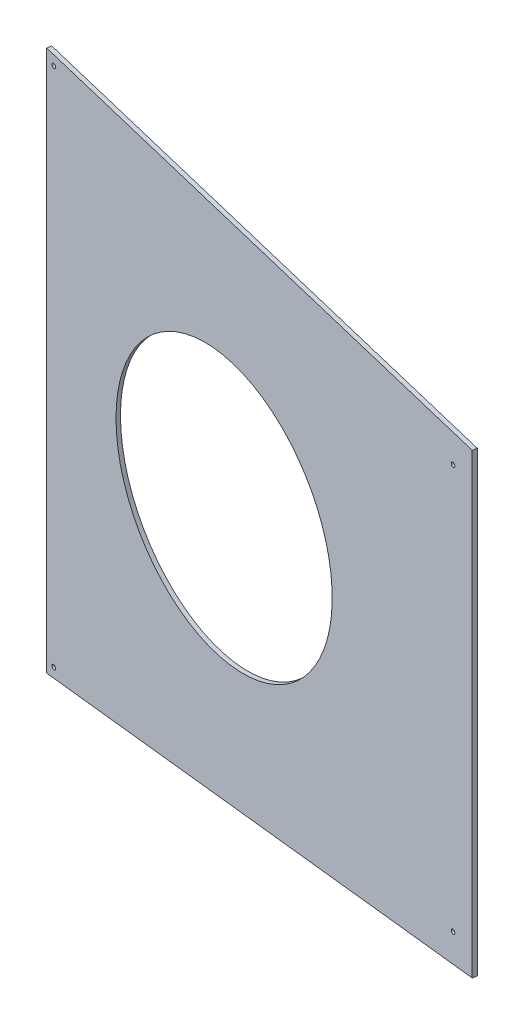
ISO-10303-21;
HEADER;
FILE_DESCRIPTION(('STEP AP214'),'2;1');
FILE_NAME('part.step','',(''),(''),'','','');
FILE_SCHEMA(('AUTOMOTIVE_DESIGN { 1 0 10303 214 1 1 1 1 }'));
ENDSEC;
DATA;
#1=APPLICATION_CONTEXT('core data for automotive mechanical design processes');
#2=APPLICATION_PROTOCOL_DEFINITION('international standard','automotive_design',2000,#1);
#3=PRODUCT_CONTEXT('',#1,'mechanical');
#4=PRODUCT('Part','Part','',(#3));
#5=PRODUCT_RELATED_PRODUCT_CATEGORY('part','',(#4));
#6=PRODUCT_DEFINITION_FORMATION('','',#4);
#7=PRODUCT_DEFINITION_CONTEXT('part definition',#1,'design');
#8=PRODUCT_DEFINITION('design','',#6,#7);
#9=PRODUCT_DEFINITION_SHAPE('','',#8);
#10=(LENGTH_UNIT() NAMED_UNIT(*) SI_UNIT(.MILLI.,.METRE.));
#11=(NAMED_UNIT(*) PLANE_ANGLE_UNIT() SI_UNIT($,.RADIAN.));
#12=(NAMED_UNIT(*) SI_UNIT($,.STERADIAN.) SOLID_ANGLE_UNIT());
#13=UNCERTAINTY_MEASURE_WITH_UNIT(LENGTH_MEASURE(1.E-05),#10,'distance_accuracy_value','');
#14=(GEOMETRIC_REPRESENTATION_CONTEXT(3) GLOBAL_UNCERTAINTY_ASSIGNED_CONTEXT((#13)) GLOBAL_UNIT_ASSIGNED_CONTEXT((#10,
#11,#12)) REPRESENTATION_CONTEXT('',''));
#15=CARTESIAN_POINT('',(0.,0.,0.));
#16=DIRECTION('',(0.,0.,1.));
#17=DIRECTION('',(1.,0.,0.));
#18=AXIS2_PLACEMENT_3D('',#15,#16,#17);
#19=CARTESIAN_POINT('',(-98.8450874332296,-2540.,1498.6));
#20=DIRECTION('',(0.,0.,-1.));
#21=DIRECTION('',(-1.,0.,0.));
#22=AXIS2_PLACEMENT_3D('',#19,#20,#21);
#23=CYLINDRICAL_SURFACE('',#22,190.5);
#24=CARTESIAN_POINT('',(-98.8450874332296,-2540.,1762.20064492164));
#25=DIRECTION('',(-0.177172313667308,0.,0.984179847014647));
#26=DIRECTION('',(-0.984179847014647,0.,-0.177172313667308));
#27=AXIS2_PLACEMENT_3D('',#24,#25,#26);
#28=ELLIPSE('',#27,193.562183352821,190.5);
#29=CARTESIAN_POINT('',(-289.34508743323,-2540.,1727.90678505852));
#30=VERTEX_POINT('',#29);
#31=EDGE_CURVE('E19',#30,#30,#28,.F.);
#32=ORIENTED_EDGE('',*,*,#31,.F.);
#33=EDGE_LOOP('',(#32));
#34=FACE_BOUND('',#33,.T.);
#35=CARTESIAN_POINT('',(-98.8450874332296,-2540.,1755.7485721433));
#36=DIRECTION('',(-0.177172313667308,0.,0.984179847014647));
#37=DIRECTION('',(-0.984179847014647,0.,-0.177172313667308));
#38=AXIS2_PLACEMENT_3D('',#35,#36,#37);
#39=ELLIPSE('',#38,193.562183352821,190.5);
#40=CARTESIAN_POINT('',(-289.34508743323,-2540.,1721.45471228019));
#41=VERTEX_POINT('',#40);
#42=EDGE_CURVE('E91',#41,#41,#39,.F.);
#43=ORIENTED_EDGE('',*,*,#42,.T.);
#44=EDGE_LOOP('',(#43));
#45=FACE_BOUND('',#44,.T.);
#46=ADVANCED_FACE('F16',(#34,#45),#23,.F.);
#47=CARTESIAN_POINT('',(-36.5643631475816,-2540.,1773.41243720943));
#48=DIRECTION('',(-0.177172313667308,0.,0.984179847014647));
#49=DIRECTION('',(0.984179847014647,0.,0.177172313667308));
#50=AXIS2_PLACEMENT_3D('',#47,#48,#49);
#51=PLANE('',#50);
#52=CARTESIAN_POINT('',(304.660631596562,-2832.1254858266,1834.83985007831));
#53=DIRECTION('',(0.177172313667308,0.,-0.984179847014646));
#54=DIRECTION('',(-0.984179847014646,0.,-0.177172313667308));
#55=AXIS2_PLACEMENT_3D('',#52,#53,#54);
#56=CIRCLE('',#55,3.175);
#57=CARTESIAN_POINT('',(301.53586058229,-2832.1254858266,1834.27732798242));
#58=VERTEX_POINT('',#57);
#59=EDGE_CURVE('E95',#58,#58,#56,.T.);
#60=ORIENTED_EDGE('',*,*,#59,.T.);
#61=EDGE_LOOP('',(#60));
#62=FACE_BOUND('',#61,.T.);
#63=CARTESIAN_POINT('',(304.660631596562,-2247.87451417467,1834.83985007831));
#64=DIRECTION('',(0.177172313667308,0.,-0.984179847014646));
#65=DIRECTION('',(-0.984179847014646,0.,-0.177172313667308));
#66=AXIS2_PLACEMENT_3D('',#63,#64,#65);
#67=CIRCLE('',#66,3.175);
#68=CARTESIAN_POINT('',(301.53586058229,-2247.87451417467,1834.27732798242));
#69=VERTEX_POINT('',#68);
#70=EDGE_CURVE('E98',#69,#69,#67,.T.);
#71=ORIENTED_EDGE('',*,*,#70,.T.);
#72=EDGE_LOOP('',(#71));
#73=FACE_BOUND('',#72,.T.);
#74=CARTESIAN_POINT('',(-399.03780081066,-2163.74919665094,1708.15987408417));
#75=DIRECTION('',(0.177172313667308,0.,-0.984179847014646));
#76=DIRECTION('',(-0.984179847014646,0.,-0.177172313667308));
#77=AXIS2_PLACEMENT_3D('',#74,#75,#76);
#78=CIRCLE('',#77,3.175);
#79=CARTESIAN_POINT('',(-402.162571824932,-2163.74919665094,1707.59735198828));
#80=VERTEX_POINT('',#79);
#81=EDGE_CURVE('E101',#80,#80,#78,.T.);
#82=ORIENTED_EDGE('',*,*,#81,.T.);
#83=EDGE_LOOP('',(#82));
#84=FACE_BOUND('',#83,.T.);
#85=CARTESIAN_POINT('',(-399.03780081066,-2916.25080334906,1708.15987408417));
#86=DIRECTION('',(0.177172313667308,0.,-0.984179847014646));
#87=DIRECTION('',(-0.984179847014646,0.,-0.177172313667308));
#88=AXIS2_PLACEMENT_3D('',#85,#86,#87);
#89=CIRCLE('',#88,3.175);
#90=CARTESIAN_POINT('',(-402.162571824932,-2916.25080334906,1707.59735198828));
#91=VERTEX_POINT('',#90);
#92=EDGE_CURVE('E103',#91,#91,#89,.T.);
#93=ORIENTED_EDGE('',*,*,#92,.T.);
#94=EDGE_LOOP('',(#93));
#95=FACE_BOUND('',#94,.T.);
#96=ORIENTED_EDGE('',*,*,#31,.T.);
#97=EDGE_LOOP('',(#96));
#98=FACE_BOUND('',#97,.T.);
#99=DIRECTION('',(0.,1.,0.));
#100=VECTOR('',#99,1.);
#101=CARTESIAN_POINT('',(-411.536884860068,-2733.2977772086,1705.90978570218));
#102=LINE('',#101,#100);
#103=CARTESIAN_POINT('',(-411.536884860066,-2148.83999999996,1705.90978570219));
#104=VERTEX_POINT('',#103);
#105=CARTESIAN_POINT('',(-411.536884860059,-2931.16000000014,1705.90978570219));
#106=VERTEX_POINT('',#105);
#107=EDGE_CURVE('E71',#104,#106,#102,.F.);
#108=ORIENTED_EDGE('',*,*,#107,.T.);
#109=DIRECTION('',(-0.981045508331542,-0.0797452222828882,-0.176608069197188));
#110=VECTOR('',#109,1.);
#111=CARTESIAN_POINT('',(338.408158565153,-2870.20000000057,1840.9150887167));
#112=LINE('',#111,#110);
#113=CARTESIAN_POINT('',(338.408158565118,-2870.20000000014,1840.91508871669));
#114=VERTEX_POINT('',#113);
#115=EDGE_CURVE('E67',#114,#106,#112,.T.);
#116=ORIENTED_EDGE('',*,*,#115,.F.);
#117=DIRECTION('',(0.,1.,0.));
#118=VECTOR('',#117,1.);
#119=CARTESIAN_POINT('',(338.408158565108,-2571.5966473095,1840.91508871669));
#120=LINE('',#119,#118);
#121=CARTESIAN_POINT('',(338.408158565109,-2209.79999999998,1840.91508871669));
#122=VERTEX_POINT('',#121);
#123=EDGE_CURVE('E58',#122,#114,#120,.F.);
#124=ORIENTED_EDGE('',*,*,#123,.F.);
#125=DIRECTION('',(0.981045508331542,-0.0797452222828877,0.176608069197188));
#126=VECTOR('',#125,1.);
#127=CARTESIAN_POINT('',(-411.536884860062,-2148.83999999993,1705.90978570218));
#128=LINE('',#127,#126);
#129=EDGE_CURVE('E53',#104,#122,#128,.T.);
#130=ORIENTED_EDGE('',*,*,#129,.F.);
#131=EDGE_LOOP('',(#108,#116,#124,#130));
#132=FACE_BOUND('',#131,.T.);
#133=ADVANCED_FACE('F70',(#62,#73,#84,#95,#98,#132),#51,.T.);
#134=CARTESIAN_POINT('',(-18.295989392741,-2899.19503777054,1776.70111463461));
#135=DIRECTION('',(0.078483640666522,-0.996815278536125,0.0141286455357704));
#136=DIRECTION('',(0.996914784881341,0.0784914752376909,0.));
#137=AXIS2_PLACEMENT_3D('',#134,#135,#136);
#138=PLANE('',#137);
#139=DIRECTION('',(0.177172313667308,0.,-0.984179847014647));
#140=VECTOR('',#139,1.);
#141=CARTESIAN_POINT('',(-411.536884860068,-2931.16,1705.90978570218));
#142=LINE('',#141,#140);
#143=CARTESIAN_POINT('',(-410.411840668393,-2931.16000000029,1699.66024367374));
#144=VERTEX_POINT('',#143);
#145=EDGE_CURVE('E105',#106,#144,#142,.T.);
#146=ORIENTED_EDGE('',*,*,#145,.T.);
#147=DIRECTION('',(0.981045508331546,0.0797452222828882,0.176608069197168));
#148=VECTOR('',#147,1.);
#149=CARTESIAN_POINT('',(-410.411840668453,-2931.16,1699.66024367372));
#150=LINE('',#149,#148);
#151=CARTESIAN_POINT('',(339.533202756784,-2870.20000000029,1834.66554668824));
#152=VERTEX_POINT('',#151);
#153=EDGE_CURVE('E78',#144,#152,#150,.T.);
#154=ORIENTED_EDGE('',*,*,#153,.T.);
#155=DIRECTION('',(0.177172313667308,0.,-0.984179847014647));
#156=VECTOR('',#155,1.);
#157=CARTESIAN_POINT('',(338.408158565108,-2870.2,1840.91508871669));
#158=LINE('',#157,#156);
#159=EDGE_CURVE('E63',#114,#152,#158,.T.);
#160=ORIENTED_EDGE('',*,*,#159,.F.);
#161=ORIENTED_EDGE('',*,*,#115,.T.);
#162=EDGE_LOOP('',(#146,#154,#160,#161));
#163=FACE_BOUND('',#162,.T.);
#164=ADVANCED_FACE('F77',(#163),#138,.T.);
#165=CARTESIAN_POINT('',(338.408158565108,-2571.5966473095,1840.91508871669));
#166=DIRECTION('',(0.984179847014647,0.,0.177172313667308));
#167=DIRECTION('',(0.177172313667308,0.,-0.984179847014647));
#168=AXIS2_PLACEMENT_3D('',#165,#166,#167);
#169=PLANE('',#168);
#170=ORIENTED_EDGE('',*,*,#159,.T.);
#171=DIRECTION('',(0.,1.,0.));
#172=VECTOR('',#171,1.);
#173=CARTESIAN_POINT('',(339.533202756726,-2540.,1834.66554668822));
#174=LINE('',#173,#172);
#175=CARTESIAN_POINT('',(339.5332027568,-2209.79999999998,1834.66554668825));
#176=VERTEX_POINT('',#175);
#177=EDGE_CURVE('E119',#152,#176,#174,.T.);
#178=ORIENTED_EDGE('',*,*,#177,.T.);
#179=DIRECTION('',(0.177172313643539,1.88825333325703E-12,-0.984179847018925));
#180=VECTOR('',#179,1.);
#181=CARTESIAN_POINT('',(338.408158565114,-2209.79999999993,1840.91508871669));
#182=LINE('',#181,#180);
#183=EDGE_CURVE('E65',#122,#176,#182,.T.);
#184=ORIENTED_EDGE('',*,*,#183,.F.);
#185=ORIENTED_EDGE('',*,*,#123,.T.);
#186=EDGE_LOOP('',(#170,#178,#184,#185));
#187=FACE_BOUND('',#186,.T.);
#188=ADVANCED_FACE('F60',(#187),#169,.T.);
#189=CARTESIAN_POINT('',(-60.5513862489284,-2177.37019188921,1769.09428703219));
#190=DIRECTION('',(0.078483640666522,0.996815278536125,0.0141286455357704));
#191=DIRECTION('',(-0.996914784881341,0.0784914752376909,0.));
#192=AXIS2_PLACEMENT_3D('',#189,#190,#191);
#193=PLANE('',#192);
#194=ORIENTED_EDGE('',*,*,#183,.T.);
#195=DIRECTION('',(-0.981045508331546,0.0797452222828882,-0.176608069197168));
#196=VECTOR('',#195,1.);
#197=CARTESIAN_POINT('',(339.533202756726,-2209.8,1834.66554668822));
#198=LINE('',#197,#196);
#199=CARTESIAN_POINT('',(-410.411840668413,-2148.83999999996,1699.66024367374));
#200=VERTEX_POINT('',#199);
#201=EDGE_CURVE('E116',#176,#200,#198,.T.);
#202=ORIENTED_EDGE('',*,*,#201,.T.);
#203=DIRECTION('',(0.177172313667308,0.,-0.984179847014647));
#204=VECTOR('',#203,1.);
#205=CARTESIAN_POINT('',(-411.536884860068,-2148.84,1705.90978570218));
#206=LINE('',#205,#204);
#207=EDGE_CURVE('E34',#200,#104,#206,.F.);
#208=ORIENTED_EDGE('',*,*,#207,.T.);
#209=ORIENTED_EDGE('',*,*,#129,.T.);
#210=EDGE_LOOP('',(#194,#202,#208,#209));
#211=FACE_BOUND('',#210,.T.);
#212=ADVANCED_FACE('F115',(#211),#193,.T.);
#213=CARTESIAN_POINT('',(-411.536884860068,-2733.2977772086,1705.90978570218));
#214=DIRECTION('',(0.984179847014647,0.,0.177172313667308));
#215=DIRECTION('',(0.177172313667308,0.,-0.984179847014647));
#216=AXIS2_PLACEMENT_3D('',#213,#214,#215);
#217=PLANE('',#216);
#218=ORIENTED_EDGE('',*,*,#107,.F.);
#219=ORIENTED_EDGE('',*,*,#207,.F.);
#220=DIRECTION('',(0.,1.,0.));
#221=VECTOR('',#220,1.);
#222=CARTESIAN_POINT('',(-410.411840668453,-2540.,1699.66024367372));
#223=LINE('',#222,#221);
#224=EDGE_CURVE('E94',#200,#144,#223,.F.);
#225=ORIENTED_EDGE('',*,*,#224,.T.);
#226=ORIENTED_EDGE('',*,*,#145,.F.);
#227=EDGE_LOOP('',(#218,#219,#225,#226));
#228=FACE_BOUND('',#227,.T.);
#229=ADVANCED_FACE('F122',(#228),#217,.F.);
#230=CARTESIAN_POINT('',(89918.6977265324,-2916.25080334906,-500000.562522148));
#231=DIRECTION('',(0.177172313667308,0.,-0.984179847014646));
#232=DIRECTION('',(-0.984179847014646,0.,-0.177172313667308));
#233=AXIS2_PLACEMENT_3D('',#230,#231,#232);
#234=CYLINDRICAL_SURFACE('',#233,3.175);
#235=CARTESIAN_POINT('',(-397.912756618993,-2916.25080334906,1701.91033205629));
#236=DIRECTION('',(0.177172313667308,0.,-0.984179847014646));
#237=DIRECTION('',(-0.984179847014646,0.,-0.177172313667308));
#238=AXIS2_PLACEMENT_3D('',#235,#236,#237);
#239=CIRCLE('',#238,3.175);
#240=CARTESIAN_POINT('',(-401.037527633265,-2916.25080334906,1701.34780996039));
#241=VERTEX_POINT('',#240);
#242=EDGE_CURVE('E88',#241,#241,#239,.T.);
#243=ORIENTED_EDGE('',*,*,#242,.T.);
#244=EDGE_LOOP('',(#243));
#245=FACE_BOUND('',#244,.T.);
#246=ORIENTED_EDGE('',*,*,#92,.F.);
#247=EDGE_LOOP('',(#246));
#248=FACE_BOUND('',#247,.T.);
#249=ADVANCED_FACE('F124',(#245,#248),#234,.F.);
#250=CARTESIAN_POINT('',(89918.6977265324,-2163.74919665094,-500000.562522148));
#251=DIRECTION('',(0.177172313667308,0.,-0.984179847014646));
#252=DIRECTION('',(-0.984179847014646,0.,-0.177172313667308));
#253=AXIS2_PLACEMENT_3D('',#250,#251,#252);
#254=CYLINDRICAL_SURFACE('',#253,3.175);
#255=CARTESIAN_POINT('',(-397.912756618993,-2163.74919665094,1701.91033205629));
#256=DIRECTION('',(0.177172313667308,0.,-0.984179847014646));
#257=DIRECTION('',(-0.984179847014646,0.,-0.177172313667308));
#258=AXIS2_PLACEMENT_3D('',#255,#256,#257);
#259=CIRCLE('',#258,3.175);
#260=CARTESIAN_POINT('',(-401.037527633265,-2163.74919665094,1701.34780996039));
#261=VERTEX_POINT('',#260);
#262=EDGE_CURVE('E85',#261,#261,#259,.T.);
#263=ORIENTED_EDGE('',*,*,#262,.T.);
#264=EDGE_LOOP('',(#263));
#265=FACE_BOUND('',#264,.T.);
#266=ORIENTED_EDGE('',*,*,#81,.F.);
#267=EDGE_LOOP('',(#266));
#268=FACE_BOUND('',#267,.T.);
#269=ADVANCED_FACE('F131',(#265,#268),#254,.F.);
#270=CARTESIAN_POINT('',(90645.2011213764,-2247.87451417467,-500000.562522148));
#271=DIRECTION('',(0.177172313667308,0.,-0.984179847014646));
#272=DIRECTION('',(-0.984179847014646,0.,-0.177172313667308));
#273=AXIS2_PLACEMENT_3D('',#270,#271,#272);
#274=CYLINDRICAL_SURFACE('',#273,3.175);
#275=CARTESIAN_POINT('',(305.785675788357,-2247.87451417467,1828.5903080498));
#276=DIRECTION('',(0.177172313667308,0.,-0.984179847014646));
#277=DIRECTION('',(-0.984179847014646,0.,-0.177172313667308));
#278=AXIS2_PLACEMENT_3D('',#275,#276,#277);
#279=CIRCLE('',#278,3.175);
#280=CARTESIAN_POINT('',(302.660904774086,-2247.87451417467,1828.0277859539));
#281=VERTEX_POINT('',#280);
#282=EDGE_CURVE('E25',#281,#281,#279,.T.);
#283=ORIENTED_EDGE('',*,*,#282,.T.);
#284=EDGE_LOOP('',(#283));
#285=FACE_BOUND('',#284,.T.);
#286=ORIENTED_EDGE('',*,*,#70,.F.);
#287=EDGE_LOOP('',(#286));
#288=FACE_BOUND('',#287,.T.);
#289=ADVANCED_FACE('F142',(#285,#288),#274,.F.);
#290=CARTESIAN_POINT('',(90645.2011213764,-2832.1254858266,-500000.562522148));
#291=DIRECTION('',(0.177172313667308,0.,-0.984179847014646));
#292=DIRECTION('',(-0.984179847014646,0.,-0.177172313667308));
#293=AXIS2_PLACEMENT_3D('',#290,#291,#292);
#294=CYLINDRICAL_SURFACE('',#293,3.175);
#295=CARTESIAN_POINT('',(305.785675788357,-2832.1254858266,1828.5903080498));
#296=DIRECTION('',(0.177172313667308,0.,-0.984179847014646));
#297=DIRECTION('',(-0.984179847014646,0.,-0.177172313667308));
#298=AXIS2_PLACEMENT_3D('',#295,#296,#297);
#299=CIRCLE('',#298,3.175);
#300=CARTESIAN_POINT('',(302.660904774086,-2832.1254858266,1828.0277859539));
#301=VERTEX_POINT('',#300);
#302=EDGE_CURVE('E11',#301,#301,#299,.T.);
#303=ORIENTED_EDGE('',*,*,#302,.T.);
#304=EDGE_LOOP('',(#303));
#305=FACE_BOUND('',#304,.T.);
#306=ORIENTED_EDGE('',*,*,#59,.F.);
#307=EDGE_LOOP('',(#306));
#308=FACE_BOUND('',#307,.T.);
#309=ADVANCED_FACE('F136',(#305,#308),#294,.F.);
#310=CARTESIAN_POINT('',(-35.4393189557898,-2540.,1767.16289518098));
#311=DIRECTION('',(-0.177172313667308,0.,0.984179847014647));
#312=DIRECTION('',(0.984179847014647,0.,0.177172313667308));
#313=AXIS2_PLACEMENT_3D('',#310,#311,#312);
#314=PLANE('',#313);
#315=ORIENTED_EDGE('',*,*,#302,.F.);
#316=EDGE_LOOP('',(#315));
#317=FACE_BOUND('',#316,.T.);
#318=ORIENTED_EDGE('',*,*,#282,.F.);
#319=EDGE_LOOP('',(#318));
#320=FACE_BOUND('',#319,.T.);
#321=ORIENTED_EDGE('',*,*,#262,.F.);
#322=EDGE_LOOP('',(#321));
#323=FACE_BOUND('',#322,.T.);
#324=ORIENTED_EDGE('',*,*,#242,.F.);
#325=EDGE_LOOP('',(#324));
#326=FACE_BOUND('',#325,.T.);
#327=ORIENTED_EDGE('',*,*,#42,.F.);
#328=EDGE_LOOP('',(#327));
#329=FACE_BOUND('',#328,.T.);
#330=ORIENTED_EDGE('',*,*,#201,.F.);
#331=ORIENTED_EDGE('',*,*,#177,.F.);
#332=ORIENTED_EDGE('',*,*,#153,.F.);
#333=ORIENTED_EDGE('',*,*,#224,.F.);
#334=EDGE_LOOP('',(#330,#331,#332,#333));
#335=FACE_BOUND('',#334,.T.);
#336=ADVANCED_FACE('F118',(#317,#320,#323,#326,#329,#335),#314,.F.);
#337=CLOSED_SHELL('',(#46,#133,#164,#188,#212,#229,#249,#269,#289,#309,#336));
#338=MANIFOLD_SOLID_BREP('B1',#337);
#339=ADVANCED_BREP_SHAPE_REPRESENTATION('',(#18,#338),#14);
#340=SHAPE_DEFINITION_REPRESENTATION(#9,#339);
ENDSEC;
END-ISO-10303-21;
